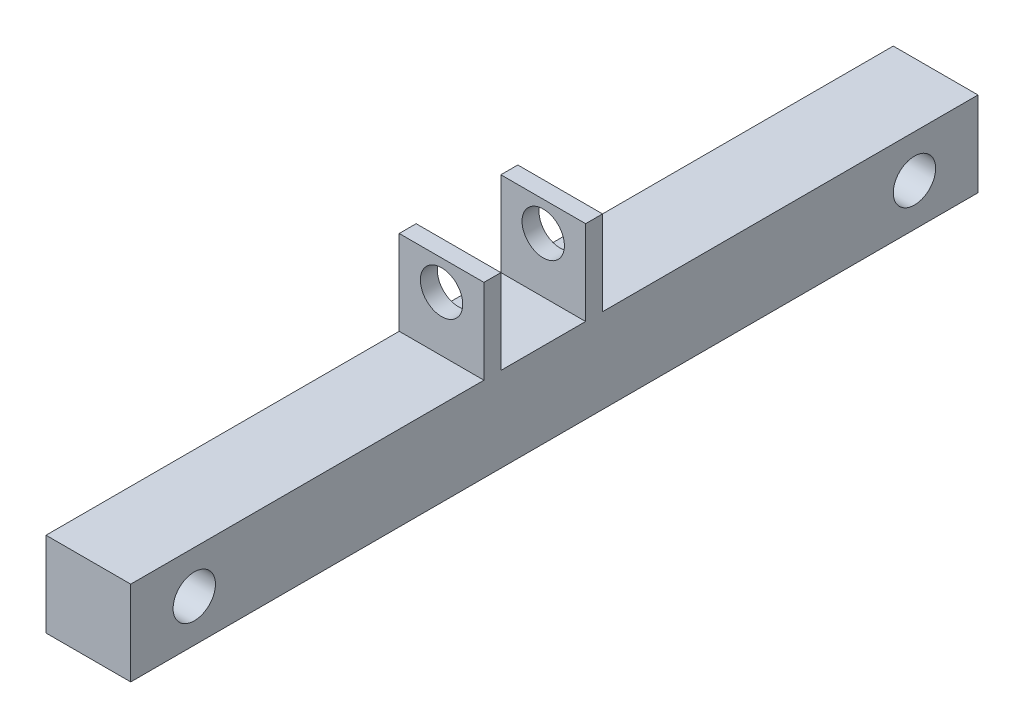
ISO-10303-21;
HEADER;
FILE_DESCRIPTION(('STEP AP214'),'2;1');
FILE_NAME('part.step','',(''),(''),'','','');
FILE_SCHEMA(('AUTOMOTIVE_DESIGN { 1 0 10303 214 1 1 1 1 }'));
ENDSEC;
DATA;
#1=APPLICATION_CONTEXT('core data for automotive mechanical design processes');
#2=APPLICATION_PROTOCOL_DEFINITION('international standard','automotive_design',2000,#1);
#3=PRODUCT_CONTEXT('',#1,'mechanical');
#4=PRODUCT('Part','Part','',(#3));
#5=PRODUCT_RELATED_PRODUCT_CATEGORY('part','',(#4));
#6=PRODUCT_DEFINITION_FORMATION('','',#4);
#7=PRODUCT_DEFINITION_CONTEXT('part definition',#1,'design');
#8=PRODUCT_DEFINITION('design','',#6,#7);
#9=PRODUCT_DEFINITION_SHAPE('','',#8);
#10=(LENGTH_UNIT() NAMED_UNIT(*) SI_UNIT(.MILLI.,.METRE.));
#11=(NAMED_UNIT(*) PLANE_ANGLE_UNIT() SI_UNIT($,.RADIAN.));
#12=(NAMED_UNIT(*) SI_UNIT($,.STERADIAN.) SOLID_ANGLE_UNIT());
#13=UNCERTAINTY_MEASURE_WITH_UNIT(LENGTH_MEASURE(1.E-05),#10,'distance_accuracy_value','');
#14=(GEOMETRIC_REPRESENTATION_CONTEXT(3) GLOBAL_UNCERTAINTY_ASSIGNED_CONTEXT((#13)) GLOBAL_UNIT_ASSIGNED_CONTEXT((#10,
#11,#12)) REPRESENTATION_CONTEXT('',''));
#15=CARTESIAN_POINT('',(0.,0.,0.));
#16=DIRECTION('',(0.,0.,1.));
#17=DIRECTION('',(1.,0.,0.));
#18=AXIS2_PLACEMENT_3D('',#15,#16,#17);
#19=CARTESIAN_POINT('',(-10.,10.,200.));
#20=DIRECTION('',(0.,-1.,0.));
#21=DIRECTION('',(0.,0.,-1.));
#22=AXIS2_PLACEMENT_3D('',#19,#20,#21);
#23=PLANE('',#22);
#24=DIRECTION('',(-1.,0.,0.));
#25=VECTOR('',#24,1.);
#26=CARTESIAN_POINT('',(0.,10.,88.6259017947352));
#27=LINE('',#26,#25);
#28=CARTESIAN_POINT('',(10.,10.,88.6259017947352));
#29=VERTEX_POINT('',#28);
#30=CARTESIAN_POINT('',(-10.,10.,88.6259017947352));
#31=VERTEX_POINT('',#30);
#32=EDGE_CURVE('E256',#29,#31,#27,.T.);
#33=ORIENTED_EDGE('',*,*,#32,.F.);
#34=DIRECTION('',(0.,0.,-1.));
#35=VECTOR('',#34,1.);
#36=CARTESIAN_POINT('',(10.,10.,200.));
#37=LINE('',#36,#35);
#38=CARTESIAN_POINT('',(10.,10.,0.));
#39=VERTEX_POINT('',#38);
#40=EDGE_CURVE('E45',#29,#39,#37,.T.);
#41=ORIENTED_EDGE('',*,*,#40,.T.);
#42=DIRECTION('',(-1.,0.,0.));
#43=VECTOR('',#42,1.);
#44=CARTESIAN_POINT('',(-10.,10.,0.));
#45=LINE('',#44,#43);
#46=CARTESIAN_POINT('',(-10.,10.,0.));
#47=VERTEX_POINT('',#46);
#48=EDGE_CURVE('E200',#39,#47,#45,.T.);
#49=ORIENTED_EDGE('',*,*,#48,.T.);
#50=DIRECTION('',(0.,0.,-1.));
#51=VECTOR('',#50,1.);
#52=CARTESIAN_POINT('',(-10.,10.,200.));
#53=LINE('',#52,#51);
#54=EDGE_CURVE('E211',#31,#47,#53,.T.);
#55=ORIENTED_EDGE('',*,*,#54,.F.);
#56=EDGE_LOOP('',(#33,#41,#49,#55));
#57=FACE_BOUND('',#56,.T.);
#58=ADVANCED_FACE('F35',(#57),#23,.F.);
#59=DIRECTION('',(1.,0.,0.));
#60=VECTOR('',#59,1.);
#61=CARTESIAN_POINT('',(0.,10.,92.6259017947352));
#62=LINE('',#61,#60);
#63=CARTESIAN_POINT('',(-10.,10.,92.6259017947352));
#64=VERTEX_POINT('',#63);
#65=CARTESIAN_POINT('',(10.,10.,92.6259017947352));
#66=VERTEX_POINT('',#65);
#67=EDGE_CURVE('E142',#64,#66,#62,.T.);
#68=ORIENTED_EDGE('',*,*,#67,.F.);
#69=CARTESIAN_POINT('',(-10.,10.,112.625901794735));
#70=VERTEX_POINT('',#69);
#71=EDGE_CURVE('E214',#70,#64,#53,.T.);
#72=ORIENTED_EDGE('',*,*,#71,.F.);
#73=DIRECTION('',(-1.,0.,0.));
#74=VECTOR('',#73,1.);
#75=CARTESIAN_POINT('',(0.,10.,112.625901794735));
#76=LINE('',#75,#74);
#77=CARTESIAN_POINT('',(10.,10.,112.625901794735));
#78=VERTEX_POINT('',#77);
#79=EDGE_CURVE('E60',#78,#70,#76,.T.);
#80=ORIENTED_EDGE('',*,*,#79,.F.);
#81=EDGE_CURVE('E44',#78,#66,#37,.T.);
#82=ORIENTED_EDGE('',*,*,#81,.T.);
#83=EDGE_LOOP('',(#68,#72,#80,#82));
#84=FACE_BOUND('',#83,.T.);
#85=ADVANCED_FACE('F254',(#84),#23,.F.);
#86=CARTESIAN_POINT('',(10.,10.,200.));
#87=DIRECTION('',(-1.,0.,0.));
#88=DIRECTION('',(0.,-1.,0.));
#89=AXIS2_PLACEMENT_3D('',#86,#87,#88);
#90=PLANE('',#89);
#91=CARTESIAN_POINT('',(9.99999999999999,0.,15.));
#92=DIRECTION('',(-1.,0.,0.));
#93=DIRECTION('',(0.,-1.,0.));
#94=AXIS2_PLACEMENT_3D('',#91,#92,#93);
#95=CIRCLE('',#94,5.);
#96=CARTESIAN_POINT('',(10.,-5.,15.));
#97=VERTEX_POINT('',#96);
#98=EDGE_CURVE('E184',#97,#97,#95,.T.);
#99=ORIENTED_EDGE('',*,*,#98,.T.);
#100=EDGE_LOOP('',(#99));
#101=FACE_BOUND('',#100,.T.);
#102=CARTESIAN_POINT('',(9.99999999999999,0.,185.));
#103=DIRECTION('',(-1.,0.,0.));
#104=DIRECTION('',(0.,-1.,0.));
#105=AXIS2_PLACEMENT_3D('',#102,#103,#104);
#106=CIRCLE('',#105,4.99999999999999);
#107=CARTESIAN_POINT('',(10.,-4.99999999999999,185.));
#108=VERTEX_POINT('',#107);
#109=EDGE_CURVE('E179',#108,#108,#106,.T.);
#110=ORIENTED_EDGE('',*,*,#109,.T.);
#111=EDGE_LOOP('',(#110));
#112=FACE_BOUND('',#111,.T.);
#113=DIRECTION('',(0.,1.,0.));
#114=VECTOR('',#113,1.);
#115=CARTESIAN_POINT('',(10.,10.,0.));
#116=LINE('',#115,#114);
#117=CARTESIAN_POINT('',(10.,-10.,0.));
#118=VERTEX_POINT('',#117);
#119=EDGE_CURVE('E187',#118,#39,#116,.T.);
#120=ORIENTED_EDGE('',*,*,#119,.T.);
#121=ORIENTED_EDGE('',*,*,#40,.F.);
#122=DIRECTION('',(0.,-1.,0.));
#123=VECTOR('',#122,1.);
#124=CARTESIAN_POINT('',(10.,30.,88.6259017947352));
#125=LINE('',#124,#123);
#126=CARTESIAN_POINT('',(10.,30.,88.6259017947352));
#127=VERTEX_POINT('',#126);
#128=EDGE_CURVE('E129',#127,#29,#125,.T.);
#129=ORIENTED_EDGE('',*,*,#128,.F.);
#130=DIRECTION('',(0.,0.,-1.));
#131=VECTOR('',#130,1.);
#132=CARTESIAN_POINT('',(10.,30.,0.));
#133=LINE('',#132,#131);
#134=CARTESIAN_POINT('',(10.,30.,92.6259017947352));
#135=VERTEX_POINT('',#134);
#136=EDGE_CURVE('E133',#135,#127,#133,.T.);
#137=ORIENTED_EDGE('',*,*,#136,.F.);
#138=DIRECTION('',(0.,-1.,0.));
#139=VECTOR('',#138,1.);
#140=CARTESIAN_POINT('',(10.,30.,92.6259017947352));
#141=LINE('',#140,#139);
#142=EDGE_CURVE('E252',#135,#66,#141,.T.);
#143=ORIENTED_EDGE('',*,*,#142,.T.);
#144=ORIENTED_EDGE('',*,*,#81,.F.);
#145=DIRECTION('',(0.,-1.,0.));
#146=VECTOR('',#145,1.);
#147=CARTESIAN_POINT('',(10.,30.,112.625901794735));
#148=LINE('',#147,#146);
#149=CARTESIAN_POINT('',(10.,30.,112.625901794735));
#150=VERTEX_POINT('',#149);
#151=EDGE_CURVE('E169',#150,#78,#148,.T.);
#152=ORIENTED_EDGE('',*,*,#151,.F.);
#153=DIRECTION('',(0.,0.,-1.));
#154=VECTOR('',#153,1.);
#155=CARTESIAN_POINT('',(10.,30.,0.));
#156=LINE('',#155,#154);
#157=CARTESIAN_POINT('',(10.,30.,116.625901794735));
#158=VERTEX_POINT('',#157);
#159=EDGE_CURVE('E156',#158,#150,#156,.T.);
#160=ORIENTED_EDGE('',*,*,#159,.F.);
#161=DIRECTION('',(0.,-1.,0.));
#162=VECTOR('',#161,1.);
#163=CARTESIAN_POINT('',(10.,30.,116.625901794735));
#164=LINE('',#163,#162);
#165=CARTESIAN_POINT('',(10.,10.,116.625901794735));
#166=VERTEX_POINT('',#165);
#167=EDGE_CURVE('E172',#158,#166,#164,.T.);
#168=ORIENTED_EDGE('',*,*,#167,.T.);
#169=CARTESIAN_POINT('',(10.,10.,200.));
#170=VERTEX_POINT('',#169);
#171=EDGE_CURVE('E11',#170,#166,#37,.T.);
#172=ORIENTED_EDGE('',*,*,#171,.F.);
#173=DIRECTION('',(0.,1.,0.));
#174=VECTOR('',#173,1.);
#175=CARTESIAN_POINT('',(10.,10.,200.));
#176=LINE('',#175,#174);
#177=CARTESIAN_POINT('',(10.,-10.,200.));
#178=VERTEX_POINT('',#177);
#179=EDGE_CURVE('E188',#178,#170,#176,.T.);
#180=ORIENTED_EDGE('',*,*,#179,.F.);
#181=DIRECTION('',(0.,0.,-1.));
#182=VECTOR('',#181,1.);
#183=CARTESIAN_POINT('',(10.,-10.,200.));
#184=LINE('',#183,#182);
#185=EDGE_CURVE('E198',#178,#118,#184,.T.);
#186=ORIENTED_EDGE('',*,*,#185,.T.);
#187=EDGE_LOOP('',(#120,#121,#129,#137,#143,#144,#152,#160,#168,#172,#180,#186));
#188=FACE_BOUND('',#187,.T.);
#189=ADVANCED_FACE('F37',(#101,#112,#188),#90,.F.);
#190=ORIENTED_EDGE('',*,*,#171,.T.);
#191=DIRECTION('',(-1.,0.,0.));
#192=VECTOR('',#191,1.);
#193=CARTESIAN_POINT('',(0.,10.,116.625901794735));
#194=LINE('',#193,#192);
#195=CARTESIAN_POINT('',(-10.,10.,116.625901794735));
#196=VERTEX_POINT('',#195);
#197=EDGE_CURVE('E146',#166,#196,#194,.T.);
#198=ORIENTED_EDGE('',*,*,#197,.T.);
#199=CARTESIAN_POINT('',(-10.,10.,200.));
#200=VERTEX_POINT('',#199);
#201=EDGE_CURVE('E212',#200,#196,#53,.T.);
#202=ORIENTED_EDGE('',*,*,#201,.F.);
#203=DIRECTION('',(-1.,0.,0.));
#204=VECTOR('',#203,1.);
#205=CARTESIAN_POINT('',(-10.,10.,200.));
#206=LINE('',#205,#204);
#207=EDGE_CURVE('E191',#170,#200,#206,.T.);
#208=ORIENTED_EDGE('',*,*,#207,.F.);
#209=EDGE_LOOP('',(#190,#198,#202,#208));
#210=FACE_BOUND('',#209,.T.);
#211=ADVANCED_FACE('F238',(#210),#23,.F.);
#212=CARTESIAN_POINT('',(-10.,10.,200.));
#213=DIRECTION('',(1.,0.,0.));
#214=DIRECTION('',(0.,1.,0.));
#215=AXIS2_PLACEMENT_3D('',#212,#213,#214);
#216=PLANE('',#215);
#217=CARTESIAN_POINT('',(-10.,0.,15.));
#218=DIRECTION('',(-1.,0.,0.));
#219=DIRECTION('',(0.,-1.,0.));
#220=AXIS2_PLACEMENT_3D('',#217,#218,#219);
#221=CIRCLE('',#220,5.);
#222=CARTESIAN_POINT('',(-10.,-5.,15.));
#223=VERTEX_POINT('',#222);
#224=EDGE_CURVE('E176',#223,#223,#221,.T.);
#225=ORIENTED_EDGE('',*,*,#224,.F.);
#226=EDGE_LOOP('',(#225));
#227=FACE_BOUND('',#226,.T.);
#228=CARTESIAN_POINT('',(-10.,0.,185.));
#229=DIRECTION('',(-1.,0.,0.));
#230=DIRECTION('',(0.,1.,0.));
#231=AXIS2_PLACEMENT_3D('',#228,#229,#230);
#232=CIRCLE('',#231,4.99999999999999);
#233=CARTESIAN_POINT('',(-10.,-4.99999999999999,185.));
#234=VERTEX_POINT('',#233);
#235=EDGE_CURVE('E175',#234,#234,#232,.T.);
#236=ORIENTED_EDGE('',*,*,#235,.F.);
#237=EDGE_LOOP('',(#236));
#238=FACE_BOUND('',#237,.T.);
#239=DIRECTION('',(0.,-1.,0.));
#240=VECTOR('',#239,1.);
#241=CARTESIAN_POINT('',(-10.,10.,0.));
#242=LINE('',#241,#240);
#243=CARTESIAN_POINT('',(-10.,-10.,0.));
#244=VERTEX_POINT('',#243);
#245=EDGE_CURVE('E203',#47,#244,#242,.T.);
#246=ORIENTED_EDGE('',*,*,#245,.T.);
#247=DIRECTION('',(0.,0.,-1.));
#248=VECTOR('',#247,1.);
#249=CARTESIAN_POINT('',(-10.,-10.,200.));
#250=LINE('',#249,#248);
#251=CARTESIAN_POINT('',(-10.,-10.,200.));
#252=VERTEX_POINT('',#251);
#253=EDGE_CURVE('E208',#252,#244,#250,.T.);
#254=ORIENTED_EDGE('',*,*,#253,.F.);
#255=DIRECTION('',(0.,-1.,0.));
#256=VECTOR('',#255,1.);
#257=CARTESIAN_POINT('',(-10.,10.,200.));
#258=LINE('',#257,#256);
#259=EDGE_CURVE('E194',#200,#252,#258,.T.);
#260=ORIENTED_EDGE('',*,*,#259,.F.);
#261=ORIENTED_EDGE('',*,*,#201,.T.);
#262=DIRECTION('',(0.,-1.,0.));
#263=VECTOR('',#262,1.);
#264=CARTESIAN_POINT('',(-10.,30.,116.625901794735));
#265=LINE('',#264,#263);
#266=CARTESIAN_POINT('',(-10.,30.,116.625901794735));
#267=VERTEX_POINT('',#266);
#268=EDGE_CURVE('E161',#267,#196,#265,.T.);
#269=ORIENTED_EDGE('',*,*,#268,.F.);
#270=DIRECTION('',(0.,0.,1.));
#271=VECTOR('',#270,1.);
#272=CARTESIAN_POINT('',(-10.,30.,0.));
#273=LINE('',#272,#271);
#274=CARTESIAN_POINT('',(-10.,30.,112.625901794735));
#275=VERTEX_POINT('',#274);
#276=EDGE_CURVE('E160',#275,#267,#273,.T.);
#277=ORIENTED_EDGE('',*,*,#276,.F.);
#278=DIRECTION('',(0.,-1.,0.));
#279=VECTOR('',#278,1.);
#280=CARTESIAN_POINT('',(-10.,30.,112.625901794735));
#281=LINE('',#280,#279);
#282=EDGE_CURVE('E166',#275,#70,#281,.T.);
#283=ORIENTED_EDGE('',*,*,#282,.T.);
#284=ORIENTED_EDGE('',*,*,#71,.T.);
#285=DIRECTION('',(0.,-1.,0.));
#286=VECTOR('',#285,1.);
#287=CARTESIAN_POINT('',(-10.,30.,92.6259017947352));
#288=LINE('',#287,#286);
#289=CARTESIAN_POINT('',(-10.,30.,92.6259017947352));
#290=VERTEX_POINT('',#289);
#291=EDGE_CURVE('E149',#290,#64,#288,.T.);
#292=ORIENTED_EDGE('',*,*,#291,.F.);
#293=DIRECTION('',(0.,0.,1.));
#294=VECTOR('',#293,1.);
#295=CARTESIAN_POINT('',(-10.,30.,0.));
#296=LINE('',#295,#294);
#297=CARTESIAN_POINT('',(-10.,30.,88.6259017947352));
#298=VERTEX_POINT('',#297);
#299=EDGE_CURVE('E132',#298,#290,#296,.T.);
#300=ORIENTED_EDGE('',*,*,#299,.F.);
#301=DIRECTION('',(0.,-1.,0.));
#302=VECTOR('',#301,1.);
#303=CARTESIAN_POINT('',(-10.,30.,88.6259017947352));
#304=LINE('',#303,#302);
#305=EDGE_CURVE('E52',#298,#31,#304,.T.);
#306=ORIENTED_EDGE('',*,*,#305,.T.);
#307=ORIENTED_EDGE('',*,*,#54,.T.);
#308=EDGE_LOOP('',(#246,#254,#260,#261,#269,#277,#283,#284,#292,#300,#306,#307));
#309=FACE_BOUND('',#308,.T.);
#310=ADVANCED_FACE('F220',(#227,#238,#309),#216,.F.);
#311=CARTESIAN_POINT('',(-10.,-10.,200.));
#312=DIRECTION('',(0.,1.,0.));
#313=DIRECTION('',(0.,0.,1.));
#314=AXIS2_PLACEMENT_3D('',#311,#312,#313);
#315=PLANE('',#314);
#316=DIRECTION('',(1.,0.,0.));
#317=VECTOR('',#316,1.);
#318=CARTESIAN_POINT('',(-10.,-10.,0.));
#319=LINE('',#318,#317);
#320=EDGE_CURVE('E192',#244,#118,#319,.T.);
#321=ORIENTED_EDGE('',*,*,#320,.T.);
#322=ORIENTED_EDGE('',*,*,#185,.F.);
#323=DIRECTION('',(1.,0.,0.));
#324=VECTOR('',#323,1.);
#325=CARTESIAN_POINT('',(-10.,-10.,200.));
#326=LINE('',#325,#324);
#327=EDGE_CURVE('E196',#252,#178,#326,.T.);
#328=ORIENTED_EDGE('',*,*,#327,.F.);
#329=ORIENTED_EDGE('',*,*,#253,.T.);
#330=EDGE_LOOP('',(#321,#322,#328,#329));
#331=FACE_BOUND('',#330,.T.);
#332=ADVANCED_FACE('F231',(#331),#315,.F.);
#333=CARTESIAN_POINT('',(0.,0.,200.));
#334=DIRECTION('',(0.,0.,1.));
#335=DIRECTION('',(1.,0.,0.));
#336=AXIS2_PLACEMENT_3D('',#333,#334,#335);
#337=PLANE('',#336);
#338=ORIENTED_EDGE('',*,*,#179,.T.);
#339=ORIENTED_EDGE('',*,*,#207,.T.);
#340=ORIENTED_EDGE('',*,*,#259,.T.);
#341=ORIENTED_EDGE('',*,*,#327,.T.);
#342=EDGE_LOOP('',(#338,#339,#340,#341));
#343=FACE_BOUND('',#342,.T.);
#344=ADVANCED_FACE('F236',(#343),#337,.T.);
#345=CARTESIAN_POINT('',(0.,0.,0.));
#346=DIRECTION('',(0.,0.,1.));
#347=DIRECTION('',(1.,0.,0.));
#348=AXIS2_PLACEMENT_3D('',#345,#346,#347);
#349=PLANE('',#348);
#350=ORIENTED_EDGE('',*,*,#119,.F.);
#351=ORIENTED_EDGE('',*,*,#320,.F.);
#352=ORIENTED_EDGE('',*,*,#245,.F.);
#353=ORIENTED_EDGE('',*,*,#48,.F.);
#354=EDGE_LOOP('',(#350,#351,#352,#353));
#355=FACE_BOUND('',#354,.T.);
#356=ADVANCED_FACE('F228',(#355),#349,.F.);
#357=CARTESIAN_POINT('',(47.,0.,185.));
#358=DIRECTION('',(-1.,0.,0.));
#359=DIRECTION('',(0.,-1.,0.));
#360=AXIS2_PLACEMENT_3D('',#357,#358,#359);
#361=CYLINDRICAL_SURFACE('',#360,4.99999999999999);
#362=CARTESIAN_POINT('',(-10.,-4.99999999999999,185.));
#363=CARTESIAN_POINT('',(-9.79166666666667,-4.99999999999999,185.));
#364=CARTESIAN_POINT('',(-9.58333333333333,-4.99999999999999,185.));
#365=CARTESIAN_POINT('',(-9.16666666666667,-4.99999999999999,185.));
#366=CARTESIAN_POINT('',(-8.95833333333333,-4.99999999999999,185.));
#367=CARTESIAN_POINT('',(-8.54166666666667,-4.99999999999999,185.));
#368=CARTESIAN_POINT('',(-8.33333333333333,-4.99999999999999,185.));
#369=CARTESIAN_POINT('',(-7.91666666666667,-4.99999999999999,185.));
#370=CARTESIAN_POINT('',(-7.70833333333333,-4.99999999999999,185.));
#371=CARTESIAN_POINT('',(-7.29166666666667,-4.99999999999999,185.));
#372=CARTESIAN_POINT('',(-7.08333333333333,-4.99999999999999,185.));
#373=CARTESIAN_POINT('',(-6.66666666666667,-4.99999999999999,185.));
#374=CARTESIAN_POINT('',(-6.45833333333333,-4.99999999999999,185.));
#375=CARTESIAN_POINT('',(-6.04166666666667,-4.99999999999999,185.));
#376=CARTESIAN_POINT('',(-5.83333333333333,-4.99999999999999,185.));
#377=CARTESIAN_POINT('',(-5.41666666666666,-4.99999999999999,185.));
#378=CARTESIAN_POINT('',(-5.20833333333333,-4.99999999999999,185.));
#379=CARTESIAN_POINT('',(-4.79166666666666,-4.99999999999999,185.));
#380=CARTESIAN_POINT('',(-4.58333333333333,-4.99999999999999,185.));
#381=CARTESIAN_POINT('',(-4.16666666666667,-4.99999999999999,185.));
#382=CARTESIAN_POINT('',(-3.95833333333333,-4.99999999999999,185.));
#383=CARTESIAN_POINT('',(-3.54166666666667,-4.99999999999999,185.));
#384=CARTESIAN_POINT('',(-3.33333333333334,-4.99999999999999,185.));
#385=CARTESIAN_POINT('',(-2.91666666666667,-4.99999999999999,185.));
#386=CARTESIAN_POINT('',(-2.70833333333334,-4.99999999999999,185.));
#387=CARTESIAN_POINT('',(-2.29166666666667,-4.99999999999999,185.));
#388=CARTESIAN_POINT('',(-2.08333333333334,-4.99999999999999,185.));
#389=CARTESIAN_POINT('',(-1.66666666666667,-4.99999999999999,185.));
#390=CARTESIAN_POINT('',(-1.45833333333333,-4.99999999999999,185.));
#391=CARTESIAN_POINT('',(-1.04166666666667,-4.99999999999999,185.));
#392=CARTESIAN_POINT('',(-0.833333333333334,-4.99999999999999,185.));
#393=CARTESIAN_POINT('',(-0.416666666666667,-4.99999999999999,185.));
#394=CARTESIAN_POINT('',(-0.208333333333333,-4.99999999999999,185.));
#395=CARTESIAN_POINT('',(0.208333333333333,-4.99999999999999,185.));
#396=CARTESIAN_POINT('',(0.416666666666667,-4.99999999999999,185.));
#397=CARTESIAN_POINT('',(0.833333333333334,-4.99999999999999,185.));
#398=CARTESIAN_POINT('',(1.04166666666667,-4.99999999999999,185.));
#399=CARTESIAN_POINT('',(1.45833333333333,-4.99999999999999,185.));
#400=CARTESIAN_POINT('',(1.66666666666667,-4.99999999999999,185.));
#401=CARTESIAN_POINT('',(2.08333333333334,-4.99999999999999,185.));
#402=CARTESIAN_POINT('',(2.29166666666667,-4.99999999999999,185.));
#403=CARTESIAN_POINT('',(2.70833333333334,-4.99999999999999,185.));
#404=CARTESIAN_POINT('',(2.91666666666667,-4.99999999999999,185.));
#405=CARTESIAN_POINT('',(3.33333333333333,-4.99999999999999,185.));
#406=CARTESIAN_POINT('',(3.54166666666667,-4.99999999999999,185.));
#407=CARTESIAN_POINT('',(3.95833333333333,-4.99999999999999,185.));
#408=CARTESIAN_POINT('',(4.16666666666666,-4.99999999999999,185.));
#409=CARTESIAN_POINT('',(4.58333333333333,-4.99999999999999,185.));
#410=CARTESIAN_POINT('',(4.79166666666666,-4.99999999999999,185.));
#411=CARTESIAN_POINT('',(5.20833333333333,-4.99999999999999,185.));
#412=CARTESIAN_POINT('',(5.41666666666666,-4.99999999999999,185.));
#413=CARTESIAN_POINT('',(5.83333333333333,-4.99999999999999,185.));
#414=CARTESIAN_POINT('',(6.04166666666667,-4.99999999999999,185.));
#415=CARTESIAN_POINT('',(6.45833333333333,-4.99999999999999,185.));
#416=CARTESIAN_POINT('',(6.66666666666667,-4.99999999999999,185.));
#417=CARTESIAN_POINT('',(7.08333333333333,-4.99999999999999,185.));
#418=CARTESIAN_POINT('',(7.29166666666667,-4.99999999999999,185.));
#419=CARTESIAN_POINT('',(7.70833333333333,-4.99999999999999,185.));
#420=CARTESIAN_POINT('',(7.91666666666667,-4.99999999999999,185.));
#421=CARTESIAN_POINT('',(8.33333333333333,-4.99999999999999,185.));
#422=CARTESIAN_POINT('',(8.54166666666667,-4.99999999999999,185.));
#423=CARTESIAN_POINT('',(8.95833333333333,-4.99999999999999,185.));
#424=CARTESIAN_POINT('',(9.16666666666667,-4.99999999999999,185.));
#425=CARTESIAN_POINT('',(9.58333333333333,-4.99999999999999,185.));
#426=CARTESIAN_POINT('',(9.79166666666667,-4.99999999999999,185.));
#427=CARTESIAN_POINT('',(10.,-4.99999999999999,185.));
#428=B_SPLINE_CURVE_WITH_KNOTS('',3,(#362,#363,#364,#365,#366,#367,#368,#369,#370,#371,#372,
#373,#374,#375,#376,#377,#378,#379,#380,#381,#382,#383,#384,#385,#386,#387,#388,#389,#390,#391,
#392,#393,#394,#395,#396,#397,#398,#399,#400,#401,#402,#403,#404,#405,#406,#407,#408,#409,#410,
#411,#412,#413,#414,#415,#416,#417,#418,#419,#420,#421,#422,#423,#424,#425,#426,#427),
.UNSPECIFIED.,.F.,.F.,(4,2,2,2,2,2,2,2,2,2,2,2,2,2,2,2,2,2,2,2,2,2,2,2,2,2,2,2,2,2,2,2,4),(0.,
0.625000000000001,1.25,1.875,2.5,3.125,3.75,4.375,5.,5.62500000000001,6.25,6.875,7.5,8.125,8.75,
9.375,10.,10.625,11.25,11.875,12.5,13.125,13.75,14.375,15.,15.625,16.25,16.875,17.5,18.125,
18.75,19.375,20.),.UNSPECIFIED.);
#429=EDGE_CURVE('BSEAM308',#234,#108,#428,.T.);
#430=ORIENTED_EDGE('',*,*,#235,.T.);
#431=ORIENTED_EDGE('',*,*,#109,.F.);
#432=ORIENTED_EDGE('',*,*,#429,.T.);
#433=ORIENTED_EDGE('',*,*,#429,.F.);
#434=EDGE_LOOP('',(#430,#432,#431,#433));
#435=FACE_BOUND('',#434,.T.);
#436=ADVANCED_FACE('F308',(#435),#361,.F.);
#437=CARTESIAN_POINT('',(47.,0.,15.));
#438=DIRECTION('',(-1.,0.,0.));
#439=DIRECTION('',(0.,-1.,0.));
#440=AXIS2_PLACEMENT_3D('',#437,#438,#439);
#441=CYLINDRICAL_SURFACE('',#440,5.);
#442=CARTESIAN_POINT('',(-10.,-5.,15.));
#443=CARTESIAN_POINT('',(-9.79166666666667,-5.,15.));
#444=CARTESIAN_POINT('',(-9.58333333333333,-5.,15.));
#445=CARTESIAN_POINT('',(-9.16666666666667,-5.,15.));
#446=CARTESIAN_POINT('',(-8.95833333333333,-5.,15.));
#447=CARTESIAN_POINT('',(-8.54166666666667,-5.,15.));
#448=CARTESIAN_POINT('',(-8.33333333333333,-5.,15.));
#449=CARTESIAN_POINT('',(-7.91666666666667,-5.,15.));
#450=CARTESIAN_POINT('',(-7.70833333333333,-5.,15.));
#451=CARTESIAN_POINT('',(-7.29166666666667,-5.,15.));
#452=CARTESIAN_POINT('',(-7.08333333333333,-5.,15.));
#453=CARTESIAN_POINT('',(-6.66666666666667,-5.,15.));
#454=CARTESIAN_POINT('',(-6.45833333333333,-5.,15.));
#455=CARTESIAN_POINT('',(-6.04166666666667,-5.,15.));
#456=CARTESIAN_POINT('',(-5.83333333333333,-5.,15.));
#457=CARTESIAN_POINT('',(-5.41666666666666,-5.,15.));
#458=CARTESIAN_POINT('',(-5.20833333333333,-5.,15.));
#459=CARTESIAN_POINT('',(-4.79166666666666,-5.,15.));
#460=CARTESIAN_POINT('',(-4.58333333333333,-5.,15.));
#461=CARTESIAN_POINT('',(-4.16666666666667,-5.,15.));
#462=CARTESIAN_POINT('',(-3.95833333333333,-5.,15.));
#463=CARTESIAN_POINT('',(-3.54166666666667,-5.,15.));
#464=CARTESIAN_POINT('',(-3.33333333333334,-5.,15.));
#465=CARTESIAN_POINT('',(-2.91666666666667,-5.,15.));
#466=CARTESIAN_POINT('',(-2.70833333333334,-5.,15.));
#467=CARTESIAN_POINT('',(-2.29166666666667,-5.,15.));
#468=CARTESIAN_POINT('',(-2.08333333333334,-5.,15.));
#469=CARTESIAN_POINT('',(-1.66666666666667,-5.,15.));
#470=CARTESIAN_POINT('',(-1.45833333333333,-5.,15.));
#471=CARTESIAN_POINT('',(-1.04166666666667,-5.,15.));
#472=CARTESIAN_POINT('',(-0.833333333333334,-5.,15.));
#473=CARTESIAN_POINT('',(-0.416666666666667,-5.,15.));
#474=CARTESIAN_POINT('',(-0.208333333333333,-5.,15.));
#475=CARTESIAN_POINT('',(0.208333333333333,-5.,15.));
#476=CARTESIAN_POINT('',(0.416666666666667,-5.,15.));
#477=CARTESIAN_POINT('',(0.833333333333334,-5.,15.));
#478=CARTESIAN_POINT('',(1.04166666666667,-5.,15.));
#479=CARTESIAN_POINT('',(1.45833333333333,-5.,15.));
#480=CARTESIAN_POINT('',(1.66666666666667,-5.,15.));
#481=CARTESIAN_POINT('',(2.08333333333334,-5.,15.));
#482=CARTESIAN_POINT('',(2.29166666666667,-5.,15.));
#483=CARTESIAN_POINT('',(2.70833333333334,-5.,15.));
#484=CARTESIAN_POINT('',(2.91666666666667,-5.,15.));
#485=CARTESIAN_POINT('',(3.33333333333333,-5.,15.));
#486=CARTESIAN_POINT('',(3.54166666666667,-5.,15.));
#487=CARTESIAN_POINT('',(3.95833333333333,-5.,15.));
#488=CARTESIAN_POINT('',(4.16666666666666,-5.,15.));
#489=CARTESIAN_POINT('',(4.58333333333333,-5.,15.));
#490=CARTESIAN_POINT('',(4.79166666666666,-5.,15.));
#491=CARTESIAN_POINT('',(5.20833333333333,-5.,15.));
#492=CARTESIAN_POINT('',(5.41666666666666,-5.,15.));
#493=CARTESIAN_POINT('',(5.83333333333333,-5.,15.));
#494=CARTESIAN_POINT('',(6.04166666666667,-5.,15.));
#495=CARTESIAN_POINT('',(6.45833333333333,-5.,15.));
#496=CARTESIAN_POINT('',(6.66666666666667,-5.,15.));
#497=CARTESIAN_POINT('',(7.08333333333333,-5.,15.));
#498=CARTESIAN_POINT('',(7.29166666666667,-5.,15.));
#499=CARTESIAN_POINT('',(7.70833333333333,-5.,15.));
#500=CARTESIAN_POINT('',(7.91666666666667,-5.,15.));
#501=CARTESIAN_POINT('',(8.33333333333333,-5.,15.));
#502=CARTESIAN_POINT('',(8.54166666666667,-5.,15.));
#503=CARTESIAN_POINT('',(8.95833333333333,-5.,15.));
#504=CARTESIAN_POINT('',(9.16666666666667,-5.,15.));
#505=CARTESIAN_POINT('',(9.58333333333333,-5.,15.));
#506=CARTESIAN_POINT('',(9.79166666666667,-5.,15.));
#507=CARTESIAN_POINT('',(10.,-5.,15.));
#508=B_SPLINE_CURVE_WITH_KNOTS('',3,(#442,#443,#444,#445,#446,#447,#448,#449,#450,#451,#452,
#453,#454,#455,#456,#457,#458,#459,#460,#461,#462,#463,#464,#465,#466,#467,#468,#469,#470,#471,
#472,#473,#474,#475,#476,#477,#478,#479,#480,#481,#482,#483,#484,#485,#486,#487,#488,#489,#490,
#491,#492,#493,#494,#495,#496,#497,#498,#499,#500,#501,#502,#503,#504,#505,#506,#507),
.UNSPECIFIED.,.F.,.F.,(4,2,2,2,2,2,2,2,2,2,2,2,2,2,2,2,2,2,2,2,2,2,2,2,2,2,2,2,2,2,2,2,4),(0.,
0.625000000000001,1.25,1.875,2.5,3.125,3.75,4.375,5.,5.62500000000001,6.25,6.875,7.5,8.125,8.75,
9.375,10.,10.625,11.25,11.875,12.5,13.125,13.75,14.375,15.,15.625,16.25,16.875,17.5,18.125,
18.75,19.375,20.),.UNSPECIFIED.);
#509=EDGE_CURVE('BSEAM310',#223,#97,#508,.T.);
#510=ORIENTED_EDGE('',*,*,#224,.T.);
#511=ORIENTED_EDGE('',*,*,#98,.F.);
#512=ORIENTED_EDGE('',*,*,#509,.T.);
#513=ORIENTED_EDGE('',*,*,#509,.F.);
#514=EDGE_LOOP('',(#510,#512,#511,#513));
#515=FACE_BOUND('',#514,.T.);
#516=ADVANCED_FACE('F310',(#515),#441,.F.);
#517=CARTESIAN_POINT('',(0.,30.,116.625901794735));
#518=DIRECTION('',(0.,0.,1.));
#519=DIRECTION('',(1.,0.,0.));
#520=AXIS2_PLACEMENT_3D('',#517,#518,#519);
#521=PLANE('',#520);
#522=CARTESIAN_POINT('',(0.,23.,116.625901794735));
#523=DIRECTION('',(0.,0.,1.));
#524=DIRECTION('',(1.,0.,0.));
#525=AXIS2_PLACEMENT_3D('',#522,#523,#524);
#526=CIRCLE('',#525,5.);
#527=CARTESIAN_POINT('',(5.,23.,116.625901794735));
#528=VERTEX_POINT('',#527);
#529=EDGE_CURVE('E264',#528,#528,#526,.T.);
#530=ORIENTED_EDGE('',*,*,#529,.F.);
#531=EDGE_LOOP('',(#530));
#532=FACE_BOUND('',#531,.T.);
#533=ORIENTED_EDGE('',*,*,#197,.F.);
#534=ORIENTED_EDGE('',*,*,#167,.F.);
#535=DIRECTION('',(-1.,0.,0.));
#536=VECTOR('',#535,1.);
#537=CARTESIAN_POINT('',(0.,30.,116.625901794735));
#538=LINE('',#537,#536);
#539=EDGE_CURVE('E153',#158,#267,#538,.T.);
#540=ORIENTED_EDGE('',*,*,#539,.T.);
#541=ORIENTED_EDGE('',*,*,#268,.T.);
#542=EDGE_LOOP('',(#533,#534,#540,#541));
#543=FACE_BOUND('',#542,.T.);
#544=ADVANCED_FACE('F241',(#532,#543),#521,.T.);
#545=CARTESIAN_POINT('',(0.,30.,112.625901794735));
#546=DIRECTION('',(0.,0.,1.));
#547=DIRECTION('',(1.,0.,0.));
#548=AXIS2_PLACEMENT_3D('',#545,#546,#547);
#549=PLANE('',#548);
#550=CARTESIAN_POINT('',(0.,23.,112.625901794735));
#551=DIRECTION('',(0.,0.,1.));
#552=DIRECTION('',(1.,0.,0.));
#553=AXIS2_PLACEMENT_3D('',#550,#551,#552);
#554=CIRCLE('',#553,5.);
#555=CARTESIAN_POINT('',(5.,23.,112.625901794735));
#556=VERTEX_POINT('',#555);
#557=EDGE_CURVE('E266',#556,#556,#554,.T.);
#558=ORIENTED_EDGE('',*,*,#557,.T.);
#559=EDGE_LOOP('',(#558));
#560=FACE_BOUND('',#559,.T.);
#561=ORIENTED_EDGE('',*,*,#79,.T.);
#562=ORIENTED_EDGE('',*,*,#282,.F.);
#563=DIRECTION('',(-1.,0.,0.));
#564=VECTOR('',#563,1.);
#565=CARTESIAN_POINT('',(0.,30.,112.625901794735));
#566=LINE('',#565,#564);
#567=EDGE_CURVE('E158',#150,#275,#566,.T.);
#568=ORIENTED_EDGE('',*,*,#567,.F.);
#569=ORIENTED_EDGE('',*,*,#151,.T.);
#570=EDGE_LOOP('',(#561,#562,#568,#569));
#571=FACE_BOUND('',#570,.T.);
#572=ADVANCED_FACE('F251',(#560,#571),#549,.F.);
#573=CARTESIAN_POINT('',(0.,30.,0.));
#574=DIRECTION('',(0.,1.,0.));
#575=DIRECTION('',(0.,0.,1.));
#576=AXIS2_PLACEMENT_3D('',#573,#574,#575);
#577=PLANE('',#576);
#578=ORIENTED_EDGE('',*,*,#539,.F.);
#579=ORIENTED_EDGE('',*,*,#159,.T.);
#580=ORIENTED_EDGE('',*,*,#567,.T.);
#581=ORIENTED_EDGE('',*,*,#276,.T.);
#582=EDGE_LOOP('',(#578,#579,#580,#581));
#583=FACE_BOUND('',#582,.T.);
#584=ADVANCED_FACE('F247',(#583),#577,.T.);
#585=CARTESIAN_POINT('',(0.,30.,88.6259017947352));
#586=DIRECTION('',(0.,0.,1.));
#587=DIRECTION('',(1.,0.,0.));
#588=AXIS2_PLACEMENT_3D('',#585,#586,#587);
#589=PLANE('',#588);
#590=CARTESIAN_POINT('',(0.,23.,88.6259017947352));
#591=DIRECTION('',(0.,0.,-1.));
#592=DIRECTION('',(-1.,0.,0.));
#593=AXIS2_PLACEMENT_3D('',#590,#591,#592);
#594=CIRCLE('',#593,5.);
#595=CARTESIAN_POINT('',(-5.,23.,88.6259017947352));
#596=VERTEX_POINT('',#595);
#597=EDGE_CURVE('E273',#596,#596,#594,.T.);
#598=ORIENTED_EDGE('',*,*,#597,.F.);
#599=EDGE_LOOP('',(#598));
#600=FACE_BOUND('',#599,.T.);
#601=ORIENTED_EDGE('',*,*,#32,.T.);
#602=ORIENTED_EDGE('',*,*,#305,.F.);
#603=DIRECTION('',(-1.,0.,0.));
#604=VECTOR('',#603,1.);
#605=CARTESIAN_POINT('',(0.,30.,88.6259017947352));
#606=LINE('',#605,#604);
#607=EDGE_CURVE('E125',#127,#298,#606,.T.);
#608=ORIENTED_EDGE('',*,*,#607,.F.);
#609=ORIENTED_EDGE('',*,*,#128,.T.);
#610=EDGE_LOOP('',(#601,#602,#608,#609));
#611=FACE_BOUND('',#610,.T.);
#612=ADVANCED_FACE('F127',(#600,#611),#589,.F.);
#613=CARTESIAN_POINT('',(0.,30.,92.6259017947352));
#614=DIRECTION('',(0.,0.,-1.));
#615=DIRECTION('',(-1.,0.,0.));
#616=AXIS2_PLACEMENT_3D('',#613,#614,#615);
#617=PLANE('',#616);
#618=CARTESIAN_POINT('',(0.,23.,92.6259017947352));
#619=DIRECTION('',(0.,0.,-1.));
#620=DIRECTION('',(-1.,0.,0.));
#621=AXIS2_PLACEMENT_3D('',#618,#619,#620);
#622=CIRCLE('',#621,5.);
#623=CARTESIAN_POINT('',(-5.,23.,92.6259017947352));
#624=VERTEX_POINT('',#623);
#625=EDGE_CURVE('E39',#624,#624,#622,.T.);
#626=ORIENTED_EDGE('',*,*,#625,.T.);
#627=EDGE_LOOP('',(#626));
#628=FACE_BOUND('',#627,.T.);
#629=ORIENTED_EDGE('',*,*,#67,.T.);
#630=ORIENTED_EDGE('',*,*,#142,.F.);
#631=DIRECTION('',(1.,0.,0.));
#632=VECTOR('',#631,1.);
#633=CARTESIAN_POINT('',(0.,30.,92.6259017947352));
#634=LINE('',#633,#632);
#635=EDGE_CURVE('E138',#290,#135,#634,.T.);
#636=ORIENTED_EDGE('',*,*,#635,.F.);
#637=ORIENTED_EDGE('',*,*,#291,.T.);
#638=EDGE_LOOP('',(#629,#630,#636,#637));
#639=FACE_BOUND('',#638,.T.);
#640=ADVANCED_FACE('F259',(#628,#639),#617,.F.);
#641=CARTESIAN_POINT('',(0.,30.,0.));
#642=DIRECTION('',(0.,1.,0.));
#643=DIRECTION('',(0.,0.,1.));
#644=AXIS2_PLACEMENT_3D('',#641,#642,#643);
#645=PLANE('',#644);
#646=ORIENTED_EDGE('',*,*,#136,.T.);
#647=ORIENTED_EDGE('',*,*,#607,.T.);
#648=ORIENTED_EDGE('',*,*,#299,.T.);
#649=ORIENTED_EDGE('',*,*,#635,.T.);
#650=EDGE_LOOP('',(#646,#647,#648,#649));
#651=FACE_BOUND('',#650,.T.);
#652=ADVANCED_FACE('F136',(#651),#645,.T.);
#653=CARTESIAN_POINT('',(0.,23.,137.625901794735));
#654=DIRECTION('',(0.,0.,-1.));
#655=DIRECTION('',(-1.,0.,0.));
#656=AXIS2_PLACEMENT_3D('',#653,#654,#655);
#657=CYLINDRICAL_SURFACE('',#656,5.);
#658=ORIENTED_EDGE('',*,*,#597,.T.);
#659=EDGE_LOOP('',(#658));
#660=FACE_BOUND('',#659,.T.);
#661=ORIENTED_EDGE('',*,*,#625,.F.);
#662=EDGE_LOOP('',(#661));
#663=FACE_BOUND('',#662,.T.);
#664=ADVANCED_FACE('F281',(#660,#663),#657,.F.);
#665=ORIENTED_EDGE('',*,*,#529,.T.);
#666=EDGE_LOOP('',(#665));
#667=FACE_BOUND('',#666,.T.);
#668=ORIENTED_EDGE('',*,*,#557,.F.);
#669=EDGE_LOOP('',(#668));
#670=FACE_BOUND('',#669,.T.);
#671=ADVANCED_FACE('F283',(#667,#670),#657,.F.);
#672=CLOSED_SHELL('',(#58,#85,#189,#211,#310,#332,#344,#356,#436,#516,#544,#572,#584,#612,#640,
#652,#664,#671));
#673=MANIFOLD_SOLID_BREP('B2',#672);
#674=ADVANCED_BREP_SHAPE_REPRESENTATION('',(#18,#673),#14);
#675=SHAPE_DEFINITION_REPRESENTATION(#9,#674);
ENDSEC;
END-ISO-10303-21;
